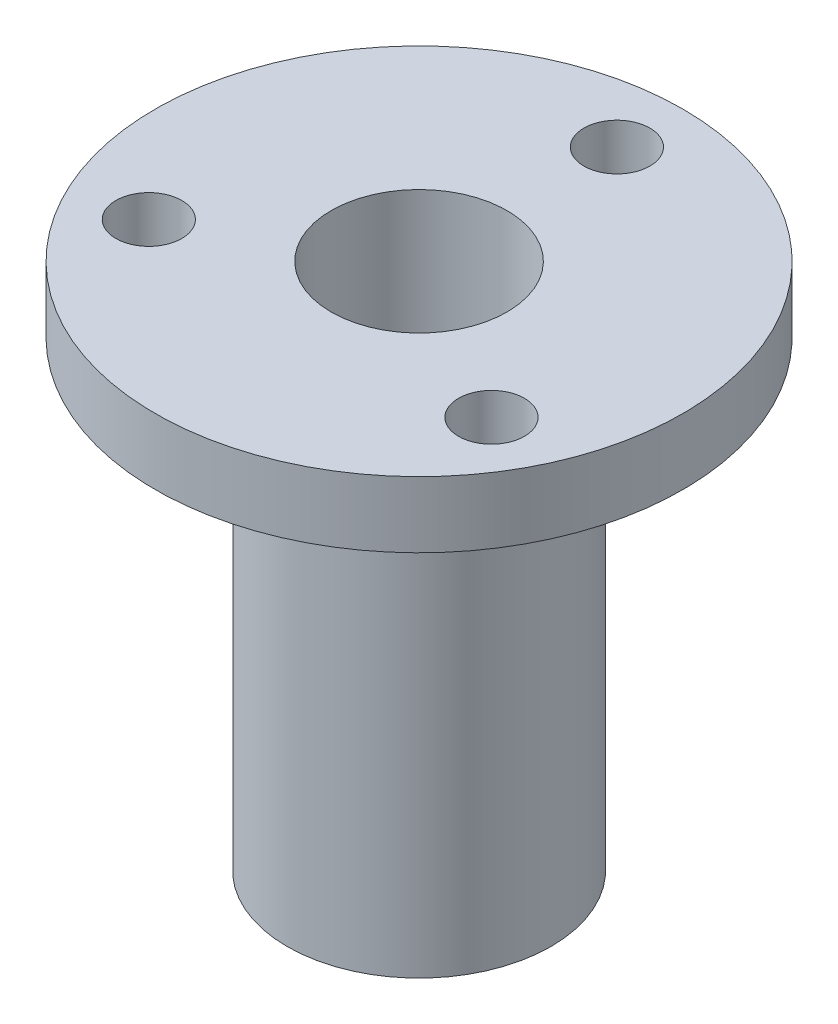
ISO-10303-21;
HEADER;
FILE_DESCRIPTION(('STEP AP214'),'2;1');
FILE_NAME('part.step','',(''),(''),'','','');
FILE_SCHEMA(('AUTOMOTIVE_DESIGN { 1 0 10303 214 1 1 1 1 }'));
ENDSEC;
DATA;
#1=APPLICATION_CONTEXT('core data for automotive mechanical design processes');
#2=APPLICATION_PROTOCOL_DEFINITION('international standard','automotive_design',2000,#1);
#3=PRODUCT_CONTEXT('',#1,'mechanical');
#4=PRODUCT('Part','Part','',(#3));
#5=PRODUCT_RELATED_PRODUCT_CATEGORY('part','',(#4));
#6=PRODUCT_DEFINITION_FORMATION('','',#4);
#7=PRODUCT_DEFINITION_CONTEXT('part definition',#1,'design');
#8=PRODUCT_DEFINITION('design','',#6,#7);
#9=PRODUCT_DEFINITION_SHAPE('','',#8);
#10=(LENGTH_UNIT() NAMED_UNIT(*) SI_UNIT(.MILLI.,.METRE.));
#11=(NAMED_UNIT(*) PLANE_ANGLE_UNIT() SI_UNIT($,.RADIAN.));
#12=(NAMED_UNIT(*) SI_UNIT($,.STERADIAN.) SOLID_ANGLE_UNIT());
#13=UNCERTAINTY_MEASURE_WITH_UNIT(LENGTH_MEASURE(1.E-05),#10,'distance_accuracy_value','');
#14=(GEOMETRIC_REPRESENTATION_CONTEXT(3) GLOBAL_UNCERTAINTY_ASSIGNED_CONTEXT((#13)) GLOBAL_UNIT_ASSIGNED_CONTEXT((#10,
#11,#12)) REPRESENTATION_CONTEXT('',''));
#15=CARTESIAN_POINT('',(0.,0.,0.));
#16=DIRECTION('',(0.,0.,1.));
#17=DIRECTION('',(1.,0.,0.));
#18=AXIS2_PLACEMENT_3D('',#15,#16,#17);
#19=CARTESIAN_POINT('',(0.,38.1,0.));
#20=DIRECTION('',(0.,-1.,0.));
#21=DIRECTION('',(0.,0.,-1.));
#22=AXIS2_PLACEMENT_3D('',#19,#20,#21);
#23=CYLINDRICAL_SURFACE('',#22,19.05);
#24=CARTESIAN_POINT('',(0.,38.1,0.));
#25=DIRECTION('',(0.,1.,0.));
#26=DIRECTION('',(0.,0.,1.));
#27=AXIS2_PLACEMENT_3D('',#24,#25,#26);
#28=CIRCLE('',#27,19.05);
#29=CARTESIAN_POINT('',(0.,38.1,-19.05));
#30=VERTEX_POINT('',#29);
#31=EDGE_CURVE('E10',#30,#30,#28,.T.);
#32=CARTESIAN_POINT('',(0.,33.3375,0.));
#33=DIRECTION('',(0.,-1.,0.));
#34=DIRECTION('',(0.,0.,-1.));
#35=AXIS2_PLACEMENT_3D('',#32,#33,#34);
#36=CIRCLE('',#35,19.05);
#37=CARTESIAN_POINT('',(0.,33.3375,-19.05));
#38=VERTEX_POINT('',#37);
#39=EDGE_CURVE('E38',#38,#38,#36,.T.);
#40=CARTESIAN_POINT('',(0.,38.1,-19.05));
#41=CARTESIAN_POINT('',(0.,38.050390625,-19.05));
#42=CARTESIAN_POINT('',(0.,38.00078125,-19.05));
#43=CARTESIAN_POINT('',(0.,37.9015625,-19.05));
#44=CARTESIAN_POINT('',(0.,37.851953125,-19.05));
#45=CARTESIAN_POINT('',(0.,37.752734375,-19.05));
#46=CARTESIAN_POINT('',(0.,37.703125,-19.05));
#47=CARTESIAN_POINT('',(0.,37.60390625,-19.05));
#48=CARTESIAN_POINT('',(0.,37.554296875,-19.05));
#49=CARTESIAN_POINT('',(0.,37.455078125,-19.05));
#50=CARTESIAN_POINT('',(0.,37.40546875,-19.05));
#51=CARTESIAN_POINT('',(0.,37.30625,-19.05));
#52=CARTESIAN_POINT('',(0.,37.256640625,-19.05));
#53=CARTESIAN_POINT('',(0.,37.157421875,-19.05));
#54=CARTESIAN_POINT('',(0.,37.1078125,-19.05));
#55=CARTESIAN_POINT('',(0.,37.00859375,-19.05));
#56=CARTESIAN_POINT('',(0.,36.958984375,-19.05));
#57=CARTESIAN_POINT('',(0.,36.859765625,-19.05));
#58=CARTESIAN_POINT('',(0.,36.81015625,-19.05));
#59=CARTESIAN_POINT('',(0.,36.7109375,-19.05));
#60=CARTESIAN_POINT('',(0.,36.661328125,-19.05));
#61=CARTESIAN_POINT('',(0.,36.562109375,-19.05));
#62=CARTESIAN_POINT('',(0.,36.5125,-19.05));
#63=CARTESIAN_POINT('',(0.,36.41328125,-19.05));
#64=CARTESIAN_POINT('',(0.,36.363671875,-19.05));
#65=CARTESIAN_POINT('',(0.,36.264453125,-19.05));
#66=CARTESIAN_POINT('',(0.,36.21484375,-19.05));
#67=CARTESIAN_POINT('',(0.,36.115625,-19.05));
#68=CARTESIAN_POINT('',(0.,36.066015625,-19.05));
#69=CARTESIAN_POINT('',(0.,35.966796875,-19.05));
#70=CARTESIAN_POINT('',(0.,35.9171875,-19.05));
#71=CARTESIAN_POINT('',(0.,35.81796875,-19.05));
#72=CARTESIAN_POINT('',(0.,35.768359375,-19.05));
#73=CARTESIAN_POINT('',(0.,35.669140625,-19.05));
#74=CARTESIAN_POINT('',(0.,35.61953125,-19.05));
#75=CARTESIAN_POINT('',(0.,35.5203125,-19.05));
#76=CARTESIAN_POINT('',(0.,35.470703125,-19.05));
#77=CARTESIAN_POINT('',(0.,35.371484375,-19.05));
#78=CARTESIAN_POINT('',(0.,35.321875,-19.05));
#79=CARTESIAN_POINT('',(0.,35.22265625,-19.05));
#80=CARTESIAN_POINT('',(0.,35.173046875,-19.05));
#81=CARTESIAN_POINT('',(0.,35.073828125,-19.05));
#82=CARTESIAN_POINT('',(0.,35.02421875,-19.05));
#83=CARTESIAN_POINT('',(0.,34.925,-19.05));
#84=CARTESIAN_POINT('',(0.,34.875390625,-19.05));
#85=CARTESIAN_POINT('',(0.,34.776171875,-19.05));
#86=CARTESIAN_POINT('',(0.,34.7265625,-19.05));
#87=CARTESIAN_POINT('',(0.,34.62734375,-19.05));
#88=CARTESIAN_POINT('',(0.,34.577734375,-19.05));
#89=CARTESIAN_POINT('',(0.,34.478515625,-19.05));
#90=CARTESIAN_POINT('',(0.,34.42890625,-19.05));
#91=CARTESIAN_POINT('',(0.,34.3296875,-19.05));
#92=CARTESIAN_POINT('',(0.,34.280078125,-19.05));
#93=CARTESIAN_POINT('',(0.,34.180859375,-19.05));
#94=CARTESIAN_POINT('',(0.,34.13125,-19.05));
#95=CARTESIAN_POINT('',(0.,34.03203125,-19.05));
#96=CARTESIAN_POINT('',(0.,33.982421875,-19.05));
#97=CARTESIAN_POINT('',(0.,33.883203125,-19.05));
#98=CARTESIAN_POINT('',(0.,33.83359375,-19.05));
#99=CARTESIAN_POINT('',(0.,33.734375,-19.05));
#100=CARTESIAN_POINT('',(0.,33.684765625,-19.05));
#101=CARTESIAN_POINT('',(0.,33.585546875,-19.05));
#102=CARTESIAN_POINT('',(0.,33.5359375,-19.05));
#103=CARTESIAN_POINT('',(0.,33.43671875,-19.05));
#104=CARTESIAN_POINT('',(0.,33.387109375,-19.05));
#105=CARTESIAN_POINT('',(0.,33.3375,-19.05));
#106=B_SPLINE_CURVE_WITH_KNOTS('',3,(#40,#41,#42,#43,#44,#45,#46,#47,#48,#49,#50,#51,#52,#53,
#54,#55,#56,#57,#58,#59,#60,#61,#62,#63,#64,#65,#66,#67,#68,#69,#70,#71,#72,#73,#74,#75,#76,#77,
#78,#79,#80,#81,#82,#83,#84,#85,#86,#87,#88,#89,#90,#91,#92,#93,#94,#95,#96,#97,#98,#99,#100,
#101,#102,#103,#104,#105),.UNSPECIFIED.,.F.,.F.,(4,2,2,2,2,2,2,2,2,2,2,2,2,2,2,2,2,2,2,2,2,2,2,
2,2,2,2,2,2,2,2,2,4),(0.,0.148828124999993,0.297656249999993,0.446484374999993,
0.595312499999993,0.744140624999994,0.892968749999994,1.04179687499999,1.19062499999999,
1.33945312499999,1.48828124999999,1.63710937499999,1.78593749999999,1.93476562499999,
2.08359374999999,2.23242187499999,2.38124999999999,2.53007812499999,2.67890624999999,
2.82773437499999,2.97656249999999,3.12539062499999,3.27421874999999,3.42304687499999,3.571875,
3.720703125,3.86953125,4.018359375,4.1671875,4.316015625,4.46484375,4.613671875,4.7625),.UNSPECIFIED.);
#107=EDGE_CURVE('BSEAM31',#30,#38,#106,.T.);
#108=ORIENTED_EDGE('',*,*,#31,.F.);
#109=ORIENTED_EDGE('',*,*,#39,.F.);
#110=ORIENTED_EDGE('',*,*,#107,.T.);
#111=ORIENTED_EDGE('',*,*,#107,.F.);
#112=EDGE_LOOP('',(#108,#110,#109,#111));
#113=FACE_BOUND('',#112,.T.);
#114=ADVANCED_FACE('F31',(#113),#23,.T.);
#115=CARTESIAN_POINT('',(0.,38.1,0.));
#116=DIRECTION('',(0.,1.,0.));
#117=DIRECTION('',(0.,0.,1.));
#118=AXIS2_PLACEMENT_3D('',#115,#116,#117);
#119=PLANE('',#118);
#120=CARTESIAN_POINT('',(0.,38.1,-14.2875));
#121=DIRECTION('',(0.,1.,0.));
#122=DIRECTION('',(0.,0.,1.));
#123=AXIS2_PLACEMENT_3D('',#120,#121,#122);
#124=CIRCLE('',#123,2.38125);
#125=CARTESIAN_POINT('',(0.,38.1,-11.90625));
#126=VERTEX_POINT('',#125);
#127=EDGE_CURVE('E50',#126,#126,#124,.T.);
#128=ORIENTED_EDGE('',*,*,#127,.F.);
#129=EDGE_LOOP('',(#128));
#130=FACE_BOUND('',#129,.T.);
#131=CARTESIAN_POINT('',(12.3733379565702,38.1,7.14374999999988));
#132=DIRECTION('',(0.,1.,0.));
#133=DIRECTION('',(0.,0.,1.));
#134=AXIS2_PLACEMENT_3D('',#131,#132,#133);
#135=CIRCLE('',#134,2.38125);
#136=CARTESIAN_POINT('',(12.3733379565702,38.1,9.52499999999988));
#137=VERTEX_POINT('',#136);
#138=EDGE_CURVE('E107',#137,#137,#135,.T.);
#139=ORIENTED_EDGE('',*,*,#138,.F.);
#140=EDGE_LOOP('',(#139));
#141=FACE_BOUND('',#140,.T.);
#142=CARTESIAN_POINT('',(-12.3733379565701,38.1,7.14375000000006));
#143=DIRECTION('',(0.,1.,0.));
#144=DIRECTION('',(0.,0.,1.));
#145=AXIS2_PLACEMENT_3D('',#142,#143,#144);
#146=CIRCLE('',#145,2.38125);
#147=CARTESIAN_POINT('',(-12.3733379565701,38.1,9.52500000000006));
#148=VERTEX_POINT('',#147);
#149=EDGE_CURVE('E111',#148,#148,#146,.T.);
#150=ORIENTED_EDGE('',*,*,#149,.F.);
#151=EDGE_LOOP('',(#150));
#152=FACE_BOUND('',#151,.T.);
#153=CARTESIAN_POINT('',(0.,38.1,0.));
#154=DIRECTION('',(0.,1.,0.));
#155=DIRECTION('',(0.,0.,1.));
#156=AXIS2_PLACEMENT_3D('',#153,#154,#155);
#157=CIRCLE('',#156,6.35);
#158=CARTESIAN_POINT('',(0.,38.1,6.35));
#159=VERTEX_POINT('',#158);
#160=EDGE_CURVE('E55',#159,#159,#157,.T.);
#161=ORIENTED_EDGE('',*,*,#160,.F.);
#162=EDGE_LOOP('',(#161));
#163=FACE_BOUND('',#162,.T.);
#164=ORIENTED_EDGE('',*,*,#31,.T.);
#165=EDGE_LOOP('',(#164));
#166=FACE_BOUND('',#165,.T.);
#167=ADVANCED_FACE('F85',(#130,#141,#152,#163,#166),#119,.T.);
#168=CARTESIAN_POINT('',(0.,33.3375,0.));
#169=DIRECTION('',(0.,-1.,0.));
#170=DIRECTION('',(0.,0.,-1.));
#171=AXIS2_PLACEMENT_3D('',#168,#169,#170);
#172=PLANE('',#171);
#173=CARTESIAN_POINT('',(0.,33.3375,-14.2875));
#174=DIRECTION('',(0.,-1.,0.));
#175=DIRECTION('',(0.,0.,-1.));
#176=AXIS2_PLACEMENT_3D('',#173,#174,#175);
#177=CIRCLE('',#176,2.38125);
#178=CARTESIAN_POINT('',(0.,33.3375,-11.90625));
#179=VERTEX_POINT('',#178);
#180=EDGE_CURVE('E34',#179,#179,#177,.T.);
#181=ORIENTED_EDGE('',*,*,#180,.F.);
#182=EDGE_LOOP('',(#181));
#183=FACE_BOUND('',#182,.T.);
#184=CARTESIAN_POINT('',(12.3733379565702,33.3375,7.14374999999988));
#185=DIRECTION('',(0.,-1.,0.));
#186=DIRECTION('',(0.,0.,-1.));
#187=AXIS2_PLACEMENT_3D('',#184,#185,#186);
#188=CIRCLE('',#187,2.38125);
#189=CARTESIAN_POINT('',(12.3733379565702,33.3375,9.52499999999988));
#190=VERTEX_POINT('',#189);
#191=EDGE_CURVE('E49',#190,#190,#188,.T.);
#192=ORIENTED_EDGE('',*,*,#191,.F.);
#193=EDGE_LOOP('',(#192));
#194=FACE_BOUND('',#193,.T.);
#195=CARTESIAN_POINT('',(-12.3733379565701,33.3375,7.14375000000006));
#196=DIRECTION('',(0.,-1.,0.));
#197=DIRECTION('',(0.,0.,-1.));
#198=AXIS2_PLACEMENT_3D('',#195,#196,#197);
#199=CIRCLE('',#198,2.38125);
#200=CARTESIAN_POINT('',(-12.3733379565701,33.3375,9.52500000000006));
#201=VERTEX_POINT('',#200);
#202=EDGE_CURVE('E47',#201,#201,#199,.T.);
#203=ORIENTED_EDGE('',*,*,#202,.F.);
#204=EDGE_LOOP('',(#203));
#205=FACE_BOUND('',#204,.T.);
#206=CARTESIAN_POINT('',(0.,33.3375,0.));
#207=DIRECTION('',(0.,-1.,0.));
#208=DIRECTION('',(0.,0.,-1.));
#209=AXIS2_PLACEMENT_3D('',#206,#207,#208);
#210=CIRCLE('',#209,9.525);
#211=CARTESIAN_POINT('',(0.,33.3375,-9.525));
#212=VERTEX_POINT('',#211);
#213=EDGE_CURVE('E43',#212,#212,#210,.T.);
#214=ORIENTED_EDGE('',*,*,#213,.F.);
#215=EDGE_LOOP('',(#214));
#216=FACE_BOUND('',#215,.T.);
#217=ORIENTED_EDGE('',*,*,#39,.T.);
#218=EDGE_LOOP('',(#217));
#219=FACE_BOUND('',#218,.T.);
#220=ADVANCED_FACE('F76',(#183,#194,#205,#216,#219),#172,.T.);
#221=CARTESIAN_POINT('',(0.,33.3375,0.));
#222=DIRECTION('',(0.,-1.,0.));
#223=DIRECTION('',(0.,0.,-1.));
#224=AXIS2_PLACEMENT_3D('',#221,#222,#223);
#225=CYLINDRICAL_SURFACE('',#224,9.525);
#226=ORIENTED_EDGE('',*,*,#213,.T.);
#227=EDGE_LOOP('',(#226));
#228=FACE_BOUND('',#227,.T.);
#229=CARTESIAN_POINT('',(0.,0.,0.));
#230=DIRECTION('',(0.,-1.,0.));
#231=DIRECTION('',(0.,0.,-1.));
#232=AXIS2_PLACEMENT_3D('',#229,#230,#231);
#233=CIRCLE('',#232,9.525);
#234=CARTESIAN_POINT('',(0.,0.,-9.525));
#235=VERTEX_POINT('',#234);
#236=EDGE_CURVE('E64',#235,#235,#233,.T.);
#237=ORIENTED_EDGE('',*,*,#236,.F.);
#238=EDGE_LOOP('',(#237));
#239=FACE_BOUND('',#238,.T.);
#240=ADVANCED_FACE('F74',(#228,#239),#225,.T.);
#241=CARTESIAN_POINT('',(0.,0.,0.));
#242=DIRECTION('',(0.,1.,0.));
#243=DIRECTION('',(0.,0.,1.));
#244=AXIS2_PLACEMENT_3D('',#241,#242,#243);
#245=PLANE('',#244);
#246=CARTESIAN_POINT('',(0.,0.,0.));
#247=DIRECTION('',(0.,1.,0.));
#248=DIRECTION('',(0.,0.,1.));
#249=AXIS2_PLACEMENT_3D('',#246,#247,#248);
#250=CIRCLE('',#249,6.35);
#251=CARTESIAN_POINT('',(0.,0.,6.35));
#252=VERTEX_POINT('',#251);
#253=EDGE_CURVE('E59',#252,#252,#250,.T.);
#254=ORIENTED_EDGE('',*,*,#253,.T.);
#255=EDGE_LOOP('',(#254));
#256=FACE_BOUND('',#255,.T.);
#257=ORIENTED_EDGE('',*,*,#236,.T.);
#258=EDGE_LOOP('',(#257));
#259=FACE_BOUND('',#258,.T.);
#260=ADVANCED_FACE('F72',(#256,#259),#245,.F.);
#261=CARTESIAN_POINT('',(0.,0.,0.));
#262=DIRECTION('',(0.,1.,0.));
#263=DIRECTION('',(0.,0.,1.));
#264=AXIS2_PLACEMENT_3D('',#261,#262,#263);
#265=CYLINDRICAL_SURFACE('',#264,6.35);
#266=CARTESIAN_POINT('',(0.,0.,6.35));
#267=CARTESIAN_POINT('',(0.,0.396875,6.35));
#268=CARTESIAN_POINT('',(0.,0.79375,6.35));
#269=CARTESIAN_POINT('',(0.,1.5875,6.35));
#270=CARTESIAN_POINT('',(0.,1.984375,6.35));
#271=CARTESIAN_POINT('',(0.,2.778125,6.35));
#272=CARTESIAN_POINT('',(0.,3.175,6.35));
#273=CARTESIAN_POINT('',(0.,3.96875,6.35));
#274=CARTESIAN_POINT('',(0.,4.365625,6.35));
#275=CARTESIAN_POINT('',(0.,5.159375,6.35));
#276=CARTESIAN_POINT('',(0.,5.55625,6.35));
#277=CARTESIAN_POINT('',(0.,6.35,6.35));
#278=CARTESIAN_POINT('',(0.,6.746875,6.35));
#279=CARTESIAN_POINT('',(0.,7.540625,6.35));
#280=CARTESIAN_POINT('',(0.,7.9375,6.35));
#281=CARTESIAN_POINT('',(0.,8.73125,6.35));
#282=CARTESIAN_POINT('',(0.,9.128125,6.35));
#283=CARTESIAN_POINT('',(0.,9.921875,6.35));
#284=CARTESIAN_POINT('',(0.,10.31875,6.35));
#285=CARTESIAN_POINT('',(0.,11.1125,6.35));
#286=CARTESIAN_POINT('',(0.,11.509375,6.35));
#287=CARTESIAN_POINT('',(0.,12.303125,6.35));
#288=CARTESIAN_POINT('',(0.,12.7,6.35));
#289=CARTESIAN_POINT('',(0.,13.49375,6.35));
#290=CARTESIAN_POINT('',(0.,13.890625,6.35));
#291=CARTESIAN_POINT('',(0.,14.684375,6.35));
#292=CARTESIAN_POINT('',(0.,15.08125,6.35));
#293=CARTESIAN_POINT('',(0.,15.875,6.35));
#294=CARTESIAN_POINT('',(0.,16.271875,6.35));
#295=CARTESIAN_POINT('',(0.,17.065625,6.35));
#296=CARTESIAN_POINT('',(0.,17.4625,6.35));
#297=CARTESIAN_POINT('',(0.,18.25625,6.35));
#298=CARTESIAN_POINT('',(0.,18.653125,6.35));
#299=CARTESIAN_POINT('',(0.,19.446875,6.35));
#300=CARTESIAN_POINT('',(0.,19.84375,6.35));
#301=CARTESIAN_POINT('',(0.,20.6375,6.35));
#302=CARTESIAN_POINT('',(0.,21.034375,6.35));
#303=CARTESIAN_POINT('',(0.,21.828125,6.35));
#304=CARTESIAN_POINT('',(0.,22.225,6.35));
#305=CARTESIAN_POINT('',(0.,23.01875,6.35));
#306=CARTESIAN_POINT('',(0.,23.415625,6.35));
#307=CARTESIAN_POINT('',(0.,24.209375,6.35));
#308=CARTESIAN_POINT('',(0.,24.60625,6.35));
#309=CARTESIAN_POINT('',(0.,25.4,6.35));
#310=CARTESIAN_POINT('',(0.,25.796875,6.35));
#311=CARTESIAN_POINT('',(0.,26.590625,6.35));
#312=CARTESIAN_POINT('',(0.,26.9875,6.35));
#313=CARTESIAN_POINT('',(0.,27.78125,6.35));
#314=CARTESIAN_POINT('',(0.,28.178125,6.35));
#315=CARTESIAN_POINT('',(0.,28.971875,6.35));
#316=CARTESIAN_POINT('',(0.,29.36875,6.35));
#317=CARTESIAN_POINT('',(0.,30.1625,6.35));
#318=CARTESIAN_POINT('',(0.,30.559375,6.35));
#319=CARTESIAN_POINT('',(0.,31.353125,6.35));
#320=CARTESIAN_POINT('',(0.,31.75,6.35));
#321=CARTESIAN_POINT('',(0.,32.54375,6.35));
#322=CARTESIAN_POINT('',(0.,32.940625,6.35));
#323=CARTESIAN_POINT('',(0.,33.734375,6.35));
#324=CARTESIAN_POINT('',(0.,34.13125,6.35));
#325=CARTESIAN_POINT('',(0.,34.925,6.35));
#326=CARTESIAN_POINT('',(0.,35.321875,6.35));
#327=CARTESIAN_POINT('',(0.,36.115625,6.35));
#328=CARTESIAN_POINT('',(0.,36.5125,6.35));
#329=CARTESIAN_POINT('',(0.,37.30625,6.35));
#330=CARTESIAN_POINT('',(0.,37.703125,6.35));
#331=CARTESIAN_POINT('',(0.,38.1,6.35));
#332=B_SPLINE_CURVE_WITH_KNOTS('',3,(#266,#267,#268,#269,#270,#271,#272,#273,#274,#275,#276,
#277,#278,#279,#280,#281,#282,#283,#284,#285,#286,#287,#288,#289,#290,#291,#292,#293,#294,#295,
#296,#297,#298,#299,#300,#301,#302,#303,#304,#305,#306,#307,#308,#309,#310,#311,#312,#313,#314,
#315,#316,#317,#318,#319,#320,#321,#322,#323,#324,#325,#326,#327,#328,#329,#330,#331),
.UNSPECIFIED.,.F.,.F.,(4,2,2,2,2,2,2,2,2,2,2,2,2,2,2,2,2,2,2,2,2,2,2,2,2,2,2,2,2,2,2,2,4),(0.,
1.190625,2.38125,3.571875,4.7625,5.953125,7.14375,8.334375,9.525,10.715625,11.90625,13.096875,
14.2875,15.478125,16.66875,17.859375,19.05,20.240625,21.43125,22.621875,23.8125,25.003125,
26.19375,27.384375,28.575,29.765625,30.95625,32.146875,33.3375,34.528125,35.71875,36.909375,
38.1),.UNSPECIFIED.);
#333=EDGE_CURVE('BSEAM83',#252,#159,#332,.T.);
#334=ORIENTED_EDGE('',*,*,#253,.F.);
#335=ORIENTED_EDGE('',*,*,#160,.T.);
#336=ORIENTED_EDGE('',*,*,#333,.T.);
#337=ORIENTED_EDGE('',*,*,#333,.F.);
#338=EDGE_LOOP('',(#334,#336,#335,#337));
#339=FACE_BOUND('',#338,.T.);
#340=ADVANCED_FACE('F83',(#339),#265,.F.);
#341=CARTESIAN_POINT('',(-12.3733379565701,0.,7.14375000000006));
#342=DIRECTION('',(0.,1.,0.));
#343=DIRECTION('',(0.,0.,1.));
#344=AXIS2_PLACEMENT_3D('',#341,#342,#343);
#345=CYLINDRICAL_SURFACE('',#344,2.38125);
#346=CARTESIAN_POINT('',(-12.3733379565701,33.3375,9.52500000000006));
#347=CARTESIAN_POINT('',(-12.3733379565701,33.387109375,9.52500000000006));
#348=CARTESIAN_POINT('',(-12.3733379565701,33.43671875,9.52500000000006));
#349=CARTESIAN_POINT('',(-12.3733379565701,33.5359375,9.52500000000006));
#350=CARTESIAN_POINT('',(-12.3733379565701,33.585546875,9.52500000000006));
#351=CARTESIAN_POINT('',(-12.3733379565701,33.684765625,9.52500000000006));
#352=CARTESIAN_POINT('',(-12.3733379565701,33.734375,9.52500000000006));
#353=CARTESIAN_POINT('',(-12.3733379565701,33.83359375,9.52500000000006));
#354=CARTESIAN_POINT('',(-12.3733379565701,33.883203125,9.52500000000006));
#355=CARTESIAN_POINT('',(-12.3733379565701,33.982421875,9.52500000000006));
#356=CARTESIAN_POINT('',(-12.3733379565701,34.03203125,9.52500000000006));
#357=CARTESIAN_POINT('',(-12.3733379565701,34.13125,9.52500000000006));
#358=CARTESIAN_POINT('',(-12.3733379565701,34.180859375,9.52500000000006));
#359=CARTESIAN_POINT('',(-12.3733379565701,34.280078125,9.52500000000006));
#360=CARTESIAN_POINT('',(-12.3733379565701,34.3296875,9.52500000000006));
#361=CARTESIAN_POINT('',(-12.3733379565701,34.42890625,9.52500000000006));
#362=CARTESIAN_POINT('',(-12.3733379565701,34.478515625,9.52500000000006));
#363=CARTESIAN_POINT('',(-12.3733379565701,34.577734375,9.52500000000006));
#364=CARTESIAN_POINT('',(-12.3733379565701,34.62734375,9.52500000000006));
#365=CARTESIAN_POINT('',(-12.3733379565701,34.7265625,9.52500000000006));
#366=CARTESIAN_POINT('',(-12.3733379565701,34.776171875,9.52500000000006));
#367=CARTESIAN_POINT('',(-12.3733379565701,34.875390625,9.52500000000006));
#368=CARTESIAN_POINT('',(-12.3733379565701,34.925,9.52500000000006));
#369=CARTESIAN_POINT('',(-12.3733379565701,35.02421875,9.52500000000006));
#370=CARTESIAN_POINT('',(-12.3733379565701,35.073828125,9.52500000000006));
#371=CARTESIAN_POINT('',(-12.3733379565701,35.173046875,9.52500000000006));
#372=CARTESIAN_POINT('',(-12.3733379565701,35.22265625,9.52500000000006));
#373=CARTESIAN_POINT('',(-12.3733379565701,35.321875,9.52500000000006));
#374=CARTESIAN_POINT('',(-12.3733379565701,35.371484375,9.52500000000006));
#375=CARTESIAN_POINT('',(-12.3733379565701,35.470703125,9.52500000000006));
#376=CARTESIAN_POINT('',(-12.3733379565701,35.5203125,9.52500000000006));
#377=CARTESIAN_POINT('',(-12.3733379565701,35.61953125,9.52500000000006));
#378=CARTESIAN_POINT('',(-12.3733379565701,35.669140625,9.52500000000006));
#379=CARTESIAN_POINT('',(-12.3733379565701,35.768359375,9.52500000000006));
#380=CARTESIAN_POINT('',(-12.3733379565701,35.81796875,9.52500000000006));
#381=CARTESIAN_POINT('',(-12.3733379565701,35.9171875,9.52500000000006));
#382=CARTESIAN_POINT('',(-12.3733379565701,35.966796875,9.52500000000006));
#383=CARTESIAN_POINT('',(-12.3733379565701,36.066015625,9.52500000000006));
#384=CARTESIAN_POINT('',(-12.3733379565701,36.115625,9.52500000000006));
#385=CARTESIAN_POINT('',(-12.3733379565701,36.21484375,9.52500000000006));
#386=CARTESIAN_POINT('',(-12.3733379565701,36.264453125,9.52500000000006));
#387=CARTESIAN_POINT('',(-12.3733379565701,36.363671875,9.52500000000006));
#388=CARTESIAN_POINT('',(-12.3733379565701,36.41328125,9.52500000000006));
#389=CARTESIAN_POINT('',(-12.3733379565701,36.5125,9.52500000000006));
#390=CARTESIAN_POINT('',(-12.3733379565701,36.562109375,9.52500000000006));
#391=CARTESIAN_POINT('',(-12.3733379565701,36.661328125,9.52500000000006));
#392=CARTESIAN_POINT('',(-12.3733379565701,36.7109375,9.52500000000006));
#393=CARTESIAN_POINT('',(-12.3733379565701,36.81015625,9.52500000000006));
#394=CARTESIAN_POINT('',(-12.3733379565701,36.859765625,9.52500000000006));
#395=CARTESIAN_POINT('',(-12.3733379565701,36.958984375,9.52500000000006));
#396=CARTESIAN_POINT('',(-12.3733379565701,37.00859375,9.52500000000006));
#397=CARTESIAN_POINT('',(-12.3733379565701,37.1078125,9.52500000000006));
#398=CARTESIAN_POINT('',(-12.3733379565701,37.157421875,9.52500000000006));
#399=CARTESIAN_POINT('',(-12.3733379565701,37.256640625,9.52500000000006));
#400=CARTESIAN_POINT('',(-12.3733379565701,37.30625,9.52500000000006));
#401=CARTESIAN_POINT('',(-12.3733379565701,37.40546875,9.52500000000006));
#402=CARTESIAN_POINT('',(-12.3733379565701,37.455078125,9.52500000000006));
#403=CARTESIAN_POINT('',(-12.3733379565701,37.554296875,9.52500000000006));
#404=CARTESIAN_POINT('',(-12.3733379565701,37.60390625,9.52500000000006));
#405=CARTESIAN_POINT('',(-12.3733379565701,37.703125,9.52500000000006));
#406=CARTESIAN_POINT('',(-12.3733379565701,37.752734375,9.52500000000006));
#407=CARTESIAN_POINT('',(-12.3733379565701,37.851953125,9.52500000000006));
#408=CARTESIAN_POINT('',(-12.3733379565701,37.9015625,9.52500000000006));
#409=CARTESIAN_POINT('',(-12.3733379565701,38.00078125,9.52500000000006));
#410=CARTESIAN_POINT('',(-12.3733379565701,38.050390625,9.52500000000006));
#411=CARTESIAN_POINT('',(-12.3733379565701,38.1,9.52500000000006));
#412=B_SPLINE_CURVE_WITH_KNOTS('',3,(#346,#347,#348,#349,#350,#351,#352,#353,#354,#355,#356,
#357,#358,#359,#360,#361,#362,#363,#364,#365,#366,#367,#368,#369,#370,#371,#372,#373,#374,#375,
#376,#377,#378,#379,#380,#381,#382,#383,#384,#385,#386,#387,#388,#389,#390,#391,#392,#393,#394,
#395,#396,#397,#398,#399,#400,#401,#402,#403,#404,#405,#406,#407,#408,#409,#410,#411),
.UNSPECIFIED.,.F.,.F.,(4,2,2,2,2,2,2,2,2,2,2,2,2,2,2,2,2,2,2,2,2,2,2,2,2,2,2,2,2,2,2,2,4),(0.,
0.148828125,0.29765625,0.446484375,0.5953125,0.744140625,0.892968750000001,1.041796875,1.190625,
1.339453125,1.48828125,1.637109375,1.7859375,1.934765625,2.08359375,2.232421875,2.38125,
2.530078125,2.67890625,2.827734375,2.9765625,3.125390625,3.27421875,3.423046875,3.571875,
3.720703125,3.86953125,4.018359375,4.1671875,4.316015625,4.46484375,4.613671875,4.7625),.UNSPECIFIED.);
#413=EDGE_CURVE('BSEAM123',#201,#148,#412,.T.);
#414=ORIENTED_EDGE('',*,*,#202,.T.);
#415=ORIENTED_EDGE('',*,*,#149,.T.);
#416=ORIENTED_EDGE('',*,*,#413,.T.);
#417=ORIENTED_EDGE('',*,*,#413,.F.);
#418=EDGE_LOOP('',(#414,#416,#415,#417));
#419=FACE_BOUND('',#418,.T.);
#420=ADVANCED_FACE('F123',(#419),#345,.F.);
#421=CARTESIAN_POINT('',(12.3733379565702,0.,7.14374999999988));
#422=DIRECTION('',(0.,1.,0.));
#423=DIRECTION('',(0.,0.,1.));
#424=AXIS2_PLACEMENT_3D('',#421,#422,#423);
#425=CYLINDRICAL_SURFACE('',#424,2.38125);
#426=CARTESIAN_POINT('',(12.3733379565702,33.3375,9.52499999999988));
#427=CARTESIAN_POINT('',(12.3733379565702,33.387109375,9.52499999999988));
#428=CARTESIAN_POINT('',(12.3733379565702,33.43671875,9.52499999999988));
#429=CARTESIAN_POINT('',(12.3733379565702,33.5359375,9.52499999999988));
#430=CARTESIAN_POINT('',(12.3733379565702,33.585546875,9.52499999999988));
#431=CARTESIAN_POINT('',(12.3733379565702,33.684765625,9.52499999999988));
#432=CARTESIAN_POINT('',(12.3733379565702,33.734375,9.52499999999988));
#433=CARTESIAN_POINT('',(12.3733379565702,33.83359375,9.52499999999988));
#434=CARTESIAN_POINT('',(12.3733379565702,33.883203125,9.52499999999988));
#435=CARTESIAN_POINT('',(12.3733379565702,33.982421875,9.52499999999988));
#436=CARTESIAN_POINT('',(12.3733379565702,34.03203125,9.52499999999988));
#437=CARTESIAN_POINT('',(12.3733379565702,34.13125,9.52499999999988));
#438=CARTESIAN_POINT('',(12.3733379565702,34.180859375,9.52499999999988));
#439=CARTESIAN_POINT('',(12.3733379565702,34.280078125,9.52499999999988));
#440=CARTESIAN_POINT('',(12.3733379565702,34.3296875,9.52499999999988));
#441=CARTESIAN_POINT('',(12.3733379565702,34.42890625,9.52499999999988));
#442=CARTESIAN_POINT('',(12.3733379565702,34.478515625,9.52499999999988));
#443=CARTESIAN_POINT('',(12.3733379565702,34.577734375,9.52499999999988));
#444=CARTESIAN_POINT('',(12.3733379565702,34.62734375,9.52499999999988));
#445=CARTESIAN_POINT('',(12.3733379565702,34.7265625,9.52499999999988));
#446=CARTESIAN_POINT('',(12.3733379565702,34.776171875,9.52499999999988));
#447=CARTESIAN_POINT('',(12.3733379565702,34.875390625,9.52499999999988));
#448=CARTESIAN_POINT('',(12.3733379565702,34.925,9.52499999999988));
#449=CARTESIAN_POINT('',(12.3733379565702,35.02421875,9.52499999999988));
#450=CARTESIAN_POINT('',(12.3733379565702,35.073828125,9.52499999999988));
#451=CARTESIAN_POINT('',(12.3733379565702,35.173046875,9.52499999999988));
#452=CARTESIAN_POINT('',(12.3733379565702,35.22265625,9.52499999999988));
#453=CARTESIAN_POINT('',(12.3733379565702,35.321875,9.52499999999988));
#454=CARTESIAN_POINT('',(12.3733379565702,35.371484375,9.52499999999988));
#455=CARTESIAN_POINT('',(12.3733379565702,35.470703125,9.52499999999988));
#456=CARTESIAN_POINT('',(12.3733379565702,35.5203125,9.52499999999988));
#457=CARTESIAN_POINT('',(12.3733379565702,35.61953125,9.52499999999988));
#458=CARTESIAN_POINT('',(12.3733379565702,35.669140625,9.52499999999988));
#459=CARTESIAN_POINT('',(12.3733379565702,35.768359375,9.52499999999988));
#460=CARTESIAN_POINT('',(12.3733379565702,35.81796875,9.52499999999988));
#461=CARTESIAN_POINT('',(12.3733379565702,35.9171875,9.52499999999988));
#462=CARTESIAN_POINT('',(12.3733379565702,35.966796875,9.52499999999988));
#463=CARTESIAN_POINT('',(12.3733379565702,36.066015625,9.52499999999988));
#464=CARTESIAN_POINT('',(12.3733379565702,36.115625,9.52499999999988));
#465=CARTESIAN_POINT('',(12.3733379565702,36.21484375,9.52499999999988));
#466=CARTESIAN_POINT('',(12.3733379565702,36.264453125,9.52499999999988));
#467=CARTESIAN_POINT('',(12.3733379565702,36.363671875,9.52499999999988));
#468=CARTESIAN_POINT('',(12.3733379565702,36.41328125,9.52499999999988));
#469=CARTESIAN_POINT('',(12.3733379565702,36.5125,9.52499999999988));
#470=CARTESIAN_POINT('',(12.3733379565702,36.562109375,9.52499999999988));
#471=CARTESIAN_POINT('',(12.3733379565702,36.661328125,9.52499999999988));
#472=CARTESIAN_POINT('',(12.3733379565702,36.7109375,9.52499999999988));
#473=CARTESIAN_POINT('',(12.3733379565702,36.81015625,9.52499999999988));
#474=CARTESIAN_POINT('',(12.3733379565702,36.859765625,9.52499999999988));
#475=CARTESIAN_POINT('',(12.3733379565702,36.958984375,9.52499999999988));
#476=CARTESIAN_POINT('',(12.3733379565702,37.00859375,9.52499999999988));
#477=CARTESIAN_POINT('',(12.3733379565702,37.1078125,9.52499999999988));
#478=CARTESIAN_POINT('',(12.3733379565702,37.157421875,9.52499999999988));
#479=CARTESIAN_POINT('',(12.3733379565702,37.256640625,9.52499999999988));
#480=CARTESIAN_POINT('',(12.3733379565702,37.30625,9.52499999999988));
#481=CARTESIAN_POINT('',(12.3733379565702,37.40546875,9.52499999999988));
#482=CARTESIAN_POINT('',(12.3733379565702,37.455078125,9.52499999999988));
#483=CARTESIAN_POINT('',(12.3733379565702,37.554296875,9.52499999999988));
#484=CARTESIAN_POINT('',(12.3733379565702,37.60390625,9.52499999999988));
#485=CARTESIAN_POINT('',(12.3733379565702,37.703125,9.52499999999988));
#486=CARTESIAN_POINT('',(12.3733379565702,37.752734375,9.52499999999988));
#487=CARTESIAN_POINT('',(12.3733379565702,37.851953125,9.52499999999988));
#488=CARTESIAN_POINT('',(12.3733379565702,37.9015625,9.52499999999988));
#489=CARTESIAN_POINT('',(12.3733379565702,38.00078125,9.52499999999988));
#490=CARTESIAN_POINT('',(12.3733379565702,38.050390625,9.52499999999988));
#491=CARTESIAN_POINT('',(12.3733379565702,38.1,9.52499999999988));
#492=B_SPLINE_CURVE_WITH_KNOTS('',3,(#426,#427,#428,#429,#430,#431,#432,#433,#434,#435,#436,
#437,#438,#439,#440,#441,#442,#443,#444,#445,#446,#447,#448,#449,#450,#451,#452,#453,#454,#455,
#456,#457,#458,#459,#460,#461,#462,#463,#464,#465,#466,#467,#468,#469,#470,#471,#472,#473,#474,
#475,#476,#477,#478,#479,#480,#481,#482,#483,#484,#485,#486,#487,#488,#489,#490,#491),
.UNSPECIFIED.,.F.,.F.,(4,2,2,2,2,2,2,2,2,2,2,2,2,2,2,2,2,2,2,2,2,2,2,2,2,2,2,2,2,2,2,2,4),(0.,
0.148828125,0.29765625,0.446484375,0.5953125,0.744140625,0.892968750000001,1.041796875,1.190625,
1.339453125,1.48828125,1.637109375,1.7859375,1.934765625,2.08359375,2.232421875,2.38125,
2.530078125,2.67890625,2.827734375,2.9765625,3.125390625,3.27421875,3.423046875,3.571875,
3.720703125,3.86953125,4.018359375,4.1671875,4.316015625,4.46484375,4.613671875,4.7625),.UNSPECIFIED.);
#493=EDGE_CURVE('BSEAM118',#190,#137,#492,.T.);
#494=ORIENTED_EDGE('',*,*,#191,.T.);
#495=ORIENTED_EDGE('',*,*,#138,.T.);
#496=ORIENTED_EDGE('',*,*,#493,.T.);
#497=ORIENTED_EDGE('',*,*,#493,.F.);
#498=EDGE_LOOP('',(#494,#496,#495,#497));
#499=FACE_BOUND('',#498,.T.);
#500=ADVANCED_FACE('F118',(#499),#425,.F.);
#501=CARTESIAN_POINT('',(0.,0.,-14.2875));
#502=DIRECTION('',(0.,1.,0.));
#503=DIRECTION('',(0.,0.,1.));
#504=AXIS2_PLACEMENT_3D('',#501,#502,#503);
#505=CYLINDRICAL_SURFACE('',#504,2.38125);
#506=CARTESIAN_POINT('',(0.,33.3375,-11.90625));
#507=CARTESIAN_POINT('',(0.,33.387109375,-11.90625));
#508=CARTESIAN_POINT('',(0.,33.43671875,-11.90625));
#509=CARTESIAN_POINT('',(0.,33.5359375,-11.90625));
#510=CARTESIAN_POINT('',(0.,33.585546875,-11.90625));
#511=CARTESIAN_POINT('',(0.,33.684765625,-11.90625));
#512=CARTESIAN_POINT('',(0.,33.734375,-11.90625));
#513=CARTESIAN_POINT('',(0.,33.83359375,-11.90625));
#514=CARTESIAN_POINT('',(0.,33.883203125,-11.90625));
#515=CARTESIAN_POINT('',(0.,33.982421875,-11.90625));
#516=CARTESIAN_POINT('',(0.,34.03203125,-11.90625));
#517=CARTESIAN_POINT('',(0.,34.13125,-11.90625));
#518=CARTESIAN_POINT('',(0.,34.180859375,-11.90625));
#519=CARTESIAN_POINT('',(0.,34.280078125,-11.90625));
#520=CARTESIAN_POINT('',(0.,34.3296875,-11.90625));
#521=CARTESIAN_POINT('',(0.,34.42890625,-11.90625));
#522=CARTESIAN_POINT('',(0.,34.478515625,-11.90625));
#523=CARTESIAN_POINT('',(0.,34.577734375,-11.90625));
#524=CARTESIAN_POINT('',(0.,34.62734375,-11.90625));
#525=CARTESIAN_POINT('',(0.,34.7265625,-11.90625));
#526=CARTESIAN_POINT('',(0.,34.776171875,-11.90625));
#527=CARTESIAN_POINT('',(0.,34.875390625,-11.90625));
#528=CARTESIAN_POINT('',(0.,34.925,-11.90625));
#529=CARTESIAN_POINT('',(0.,35.02421875,-11.90625));
#530=CARTESIAN_POINT('',(0.,35.073828125,-11.90625));
#531=CARTESIAN_POINT('',(0.,35.173046875,-11.90625));
#532=CARTESIAN_POINT('',(0.,35.22265625,-11.90625));
#533=CARTESIAN_POINT('',(0.,35.321875,-11.90625));
#534=CARTESIAN_POINT('',(0.,35.371484375,-11.90625));
#535=CARTESIAN_POINT('',(0.,35.470703125,-11.90625));
#536=CARTESIAN_POINT('',(0.,35.5203125,-11.90625));
#537=CARTESIAN_POINT('',(0.,35.61953125,-11.90625));
#538=CARTESIAN_POINT('',(0.,35.669140625,-11.90625));
#539=CARTESIAN_POINT('',(0.,35.768359375,-11.90625));
#540=CARTESIAN_POINT('',(0.,35.81796875,-11.90625));
#541=CARTESIAN_POINT('',(0.,35.9171875,-11.90625));
#542=CARTESIAN_POINT('',(0.,35.966796875,-11.90625));
#543=CARTESIAN_POINT('',(0.,36.066015625,-11.90625));
#544=CARTESIAN_POINT('',(0.,36.115625,-11.90625));
#545=CARTESIAN_POINT('',(0.,36.21484375,-11.90625));
#546=CARTESIAN_POINT('',(0.,36.264453125,-11.90625));
#547=CARTESIAN_POINT('',(0.,36.363671875,-11.90625));
#548=CARTESIAN_POINT('',(0.,36.41328125,-11.90625));
#549=CARTESIAN_POINT('',(0.,36.5125,-11.90625));
#550=CARTESIAN_POINT('',(0.,36.562109375,-11.90625));
#551=CARTESIAN_POINT('',(0.,36.661328125,-11.90625));
#552=CARTESIAN_POINT('',(0.,36.7109375,-11.90625));
#553=CARTESIAN_POINT('',(0.,36.81015625,-11.90625));
#554=CARTESIAN_POINT('',(0.,36.859765625,-11.90625));
#555=CARTESIAN_POINT('',(0.,36.958984375,-11.90625));
#556=CARTESIAN_POINT('',(0.,37.00859375,-11.90625));
#557=CARTESIAN_POINT('',(0.,37.1078125,-11.90625));
#558=CARTESIAN_POINT('',(0.,37.157421875,-11.90625));
#559=CARTESIAN_POINT('',(0.,37.256640625,-11.90625));
#560=CARTESIAN_POINT('',(0.,37.30625,-11.90625));
#561=CARTESIAN_POINT('',(0.,37.40546875,-11.90625));
#562=CARTESIAN_POINT('',(0.,37.455078125,-11.90625));
#563=CARTESIAN_POINT('',(0.,37.554296875,-11.90625));
#564=CARTESIAN_POINT('',(0.,37.60390625,-11.90625));
#565=CARTESIAN_POINT('',(0.,37.703125,-11.90625));
#566=CARTESIAN_POINT('',(0.,37.752734375,-11.90625));
#567=CARTESIAN_POINT('',(0.,37.851953125,-11.90625));
#568=CARTESIAN_POINT('',(0.,37.9015625,-11.90625));
#569=CARTESIAN_POINT('',(0.,38.00078125,-11.90625));
#570=CARTESIAN_POINT('',(0.,38.050390625,-11.90625));
#571=CARTESIAN_POINT('',(0.,38.1,-11.90625));
#572=B_SPLINE_CURVE_WITH_KNOTS('',3,(#506,#507,#508,#509,#510,#511,#512,#513,#514,#515,#516,
#517,#518,#519,#520,#521,#522,#523,#524,#525,#526,#527,#528,#529,#530,#531,#532,#533,#534,#535,
#536,#537,#538,#539,#540,#541,#542,#543,#544,#545,#546,#547,#548,#549,#550,#551,#552,#553,#554,
#555,#556,#557,#558,#559,#560,#561,#562,#563,#564,#565,#566,#567,#568,#569,#570,#571),
.UNSPECIFIED.,.F.,.F.,(4,2,2,2,2,2,2,2,2,2,2,2,2,2,2,2,2,2,2,2,2,2,2,2,2,2,2,2,2,2,2,2,4),(0.,
0.148828125,0.29765625,0.446484375,0.5953125,0.744140625,0.892968750000001,1.041796875,1.190625,
1.339453125,1.48828125,1.637109375,1.7859375,1.934765625,2.08359375,2.232421875,2.38125,
2.530078125,2.67890625,2.827734375,2.9765625,3.125390625,3.27421875,3.423046875,3.571875,
3.720703125,3.86953125,4.018359375,4.1671875,4.316015625,4.46484375,4.613671875,4.7625),.UNSPECIFIED.);
#573=EDGE_CURVE('BSEAM116',#179,#126,#572,.T.);
#574=ORIENTED_EDGE('',*,*,#180,.T.);
#575=ORIENTED_EDGE('',*,*,#127,.T.);
#576=ORIENTED_EDGE('',*,*,#573,.T.);
#577=ORIENTED_EDGE('',*,*,#573,.F.);
#578=EDGE_LOOP('',(#574,#576,#575,#577));
#579=FACE_BOUND('',#578,.T.);
#580=ADVANCED_FACE('F116',(#579),#505,.F.);
#581=CLOSED_SHELL('',(#114,#167,#220,#240,#260,#340,#420,#500,#580));
#582=MANIFOLD_SOLID_BREP('B2',#581);
#583=ADVANCED_BREP_SHAPE_REPRESENTATION('',(#18,#582),#14);
#584=SHAPE_DEFINITION_REPRESENTATION(#9,#583);
ENDSEC;
END-ISO-10303-21;
